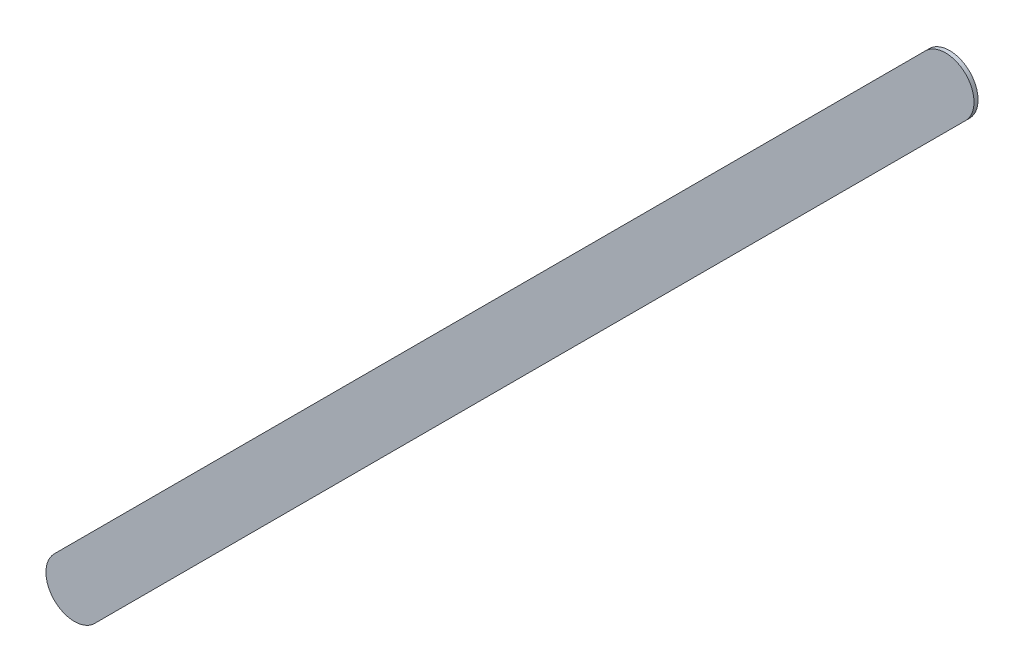
ISO-10303-21;
HEADER;
FILE_DESCRIPTION(('STEP AP214'),'2;1');
FILE_NAME('part.step','',(''),(''),'','','');
FILE_SCHEMA(('AUTOMOTIVE_DESIGN { 1 0 10303 214 1 1 1 1 }'));
ENDSEC;
DATA;
#1=APPLICATION_CONTEXT('core data for automotive mechanical design processes');
#2=APPLICATION_PROTOCOL_DEFINITION('international standard','automotive_design',2000,#1);
#3=PRODUCT_CONTEXT('',#1,'mechanical');
#4=PRODUCT('Part','Part','',(#3));
#5=PRODUCT_RELATED_PRODUCT_CATEGORY('part','',(#4));
#6=PRODUCT_DEFINITION_FORMATION('','',#4);
#7=PRODUCT_DEFINITION_CONTEXT('part definition',#1,'design');
#8=PRODUCT_DEFINITION('design','',#6,#7);
#9=PRODUCT_DEFINITION_SHAPE('','',#8);
#10=(LENGTH_UNIT() NAMED_UNIT(*) SI_UNIT(.MILLI.,.METRE.));
#11=(NAMED_UNIT(*) PLANE_ANGLE_UNIT() SI_UNIT($,.RADIAN.));
#12=(NAMED_UNIT(*) SI_UNIT($,.STERADIAN.) SOLID_ANGLE_UNIT());
#13=UNCERTAINTY_MEASURE_WITH_UNIT(LENGTH_MEASURE(1.E-05),#10,'distance_accuracy_value','');
#14=(GEOMETRIC_REPRESENTATION_CONTEXT(3) GLOBAL_UNCERTAINTY_ASSIGNED_CONTEXT((#13)) GLOBAL_UNIT_ASSIGNED_CONTEXT((#10,
#11,#12)) REPRESENTATION_CONTEXT('',''));
#15=CARTESIAN_POINT('',(0.,0.,0.));
#16=DIRECTION('',(0.,0.,1.));
#17=DIRECTION('',(1.,0.,0.));
#18=AXIS2_PLACEMENT_3D('',#15,#16,#17);
#19=CARTESIAN_POINT('',(89.6779766,72.92442362,0.));
#20=DIRECTION('',(-0.707106781186547,0.707106781186548,0.));
#21=DIRECTION('',(0.707106781186548,0.707106781186547,0.));
#22=AXIS2_PLACEMENT_3D('',#19,#20,#21);
#23=PLANE('',#22);
#24=DIRECTION('',(0.707106781186548,0.707106781186547,0.));
#25=VECTOR('',#24,1.);
#26=CARTESIAN_POINT('',(89.6779766,72.92442362,0.03556));
#27=LINE('',#26,#25);
#28=CARTESIAN_POINT('',(89.6779766,72.92442362,0.03556));
#29=VERTEX_POINT('',#28);
#30=CARTESIAN_POINT('',(97.33077562,80.57722264,0.03556));
#31=VERTEX_POINT('',#30);
#32=EDGE_CURVE('E11',#29,#31,#27,.T.);
#33=ORIENTED_EDGE('',*,*,#32,.F.);
#34=DIRECTION('',(0.,0.,1.));
#35=VECTOR('',#34,1.);
#36=CARTESIAN_POINT('',(89.6779766,72.92442362,0.));
#37=LINE('',#36,#35);
#38=CARTESIAN_POINT('',(89.6779766,72.92442362,0.));
#39=VERTEX_POINT('',#38);
#40=EDGE_CURVE('E24',#39,#29,#37,.T.);
#41=ORIENTED_EDGE('',*,*,#40,.F.);
#42=DIRECTION('',(0.707106781186548,0.707106781186547,0.));
#43=VECTOR('',#42,1.);
#44=CARTESIAN_POINT('',(89.6779766,72.92442362,0.));
#45=LINE('',#44,#43);
#46=CARTESIAN_POINT('',(97.33077562,80.57722264,0.));
#47=VERTEX_POINT('',#46);
#48=EDGE_CURVE('E75',#39,#47,#45,.T.);
#49=ORIENTED_EDGE('',*,*,#48,.T.);
#50=DIRECTION('',(0.,0.,1.));
#51=VECTOR('',#50,1.);
#52=CARTESIAN_POINT('',(97.33077562,80.57722264,0.));
#53=LINE('',#52,#51);
#54=EDGE_CURVE('E37',#47,#31,#53,.T.);
#55=ORIENTED_EDGE('',*,*,#54,.T.);
#56=EDGE_LOOP('',(#33,#41,#49,#55));
#57=FACE_BOUND('',#56,.T.);
#58=ADVANCED_FACE('F17',(#57),#23,.F.);
#59=CARTESIAN_POINT('',(97.15399924,80.75399902,0.));
#60=DIRECTION('',(0.,0.,-1.));
#61=DIRECTION('',(0.707106781186548,-0.707106781186548,0.));
#62=AXIS2_PLACEMENT_3D('',#59,#60,#61);
#63=CYLINDRICAL_SURFACE('',#62,0.249999554103226);
#64=CARTESIAN_POINT('',(97.15399924,80.75399902,0.03556));
#65=DIRECTION('',(0.,0.,1.));
#66=DIRECTION('',(0.707106781186548,-0.707106781186548,0.));
#67=AXIS2_PLACEMENT_3D('',#64,#65,#66);
#68=CIRCLE('',#67,0.249999554103226);
#69=CARTESIAN_POINT('',(96.97722286,80.9307754,0.03556));
#70=VERTEX_POINT('',#69);
#71=EDGE_CURVE('E83',#31,#70,#68,.T.);
#72=ORIENTED_EDGE('',*,*,#71,.F.);
#73=ORIENTED_EDGE('',*,*,#54,.F.);
#74=CARTESIAN_POINT('',(97.15399924,80.75399902,0.));
#75=DIRECTION('',(0.,0.,1.));
#76=DIRECTION('',(0.707106781186548,-0.707106781186548,0.));
#77=AXIS2_PLACEMENT_3D('',#74,#75,#76);
#78=CIRCLE('',#77,0.249999554103226);
#79=CARTESIAN_POINT('',(96.97722286,80.9307754,0.));
#80=VERTEX_POINT('',#79);
#81=EDGE_CURVE('E81',#47,#80,#78,.T.);
#82=ORIENTED_EDGE('',*,*,#81,.T.);
#83=DIRECTION('',(0.,0.,1.));
#84=VECTOR('',#83,1.);
#85=CARTESIAN_POINT('',(96.97722286,80.9307754,0.));
#86=LINE('',#85,#84);
#87=EDGE_CURVE('E67',#80,#70,#86,.T.);
#88=ORIENTED_EDGE('',*,*,#87,.T.);
#89=EDGE_LOOP('',(#72,#73,#82,#88));
#90=FACE_BOUND('',#89,.T.);
#91=ADVANCED_FACE('F89',(#90),#63,.T.);
#92=CARTESIAN_POINT('',(96.97722286,80.9307754,0.));
#93=DIRECTION('',(0.707106781186548,-0.707106781186548,0.));
#94=DIRECTION('',(-0.707106781186548,-0.707106781186548,0.));
#95=AXIS2_PLACEMENT_3D('',#92,#93,#94);
#96=PLANE('',#95);
#97=DIRECTION('',(-0.707106781186548,-0.707106781186548,0.));
#98=VECTOR('',#97,1.);
#99=CARTESIAN_POINT('',(96.97722286,80.9307754,0.03556));
#100=LINE('',#99,#98);
#101=CARTESIAN_POINT('',(89.32442384,73.27797638,0.03556));
#102=VERTEX_POINT('',#101);
#103=EDGE_CURVE('E71',#70,#102,#100,.T.);
#104=ORIENTED_EDGE('',*,*,#103,.F.);
#105=ORIENTED_EDGE('',*,*,#87,.F.);
#106=DIRECTION('',(-0.707106781186548,-0.707106781186548,0.));
#107=VECTOR('',#106,1.);
#108=CARTESIAN_POINT('',(96.97722286,80.9307754,0.));
#109=LINE('',#108,#107);
#110=CARTESIAN_POINT('',(89.32442384,73.27797638,0.));
#111=VERTEX_POINT('',#110);
#112=EDGE_CURVE('E63',#80,#111,#109,.T.);
#113=ORIENTED_EDGE('',*,*,#112,.T.);
#114=DIRECTION('',(0.,0.,1.));
#115=VECTOR('',#114,1.);
#116=CARTESIAN_POINT('',(89.32442384,73.27797638,0.));
#117=LINE('',#116,#115);
#118=EDGE_CURVE('E53',#111,#102,#117,.T.);
#119=ORIENTED_EDGE('',*,*,#118,.T.);
#120=EDGE_LOOP('',(#104,#105,#113,#119));
#121=FACE_BOUND('',#120,.T.);
#122=ADVANCED_FACE('F66',(#121),#96,.F.);
#123=CARTESIAN_POINT('',(89.50120022,73.1012,0.));
#124=DIRECTION('',(0.,0.,-1.));
#125=DIRECTION('',(-0.707106781186548,0.707106781186548,0.));
#126=AXIS2_PLACEMENT_3D('',#123,#124,#125);
#127=CYLINDRICAL_SURFACE('',#126,0.24999955410322);
#128=CARTESIAN_POINT('',(89.50120022,73.1012,0.03556));
#129=DIRECTION('',(0.,0.,1.));
#130=DIRECTION('',(-0.707106781186548,0.707106781186548,0.));
#131=AXIS2_PLACEMENT_3D('',#128,#129,#130);
#132=CIRCLE('',#131,0.24999955410322);
#133=EDGE_CURVE('E59',#102,#29,#132,.T.);
#134=ORIENTED_EDGE('',*,*,#133,.F.);
#135=ORIENTED_EDGE('',*,*,#118,.F.);
#136=CARTESIAN_POINT('',(89.50120022,73.1012,0.));
#137=DIRECTION('',(0.,0.,1.));
#138=DIRECTION('',(-0.707106781186548,0.707106781186548,0.));
#139=AXIS2_PLACEMENT_3D('',#136,#137,#138);
#140=CIRCLE('',#139,0.24999955410322);
#141=EDGE_CURVE('E57',#111,#39,#140,.T.);
#142=ORIENTED_EDGE('',*,*,#141,.T.);
#143=ORIENTED_EDGE('',*,*,#40,.T.);
#144=EDGE_LOOP('',(#134,#135,#142,#143));
#145=FACE_BOUND('',#144,.T.);
#146=ADVANCED_FACE('F55',(#145),#127,.T.);
#147=CARTESIAN_POINT('',(89.6779766,72.92442362,0.));
#148=DIRECTION('',(0.,0.,-1.));
#149=DIRECTION('',(-1.,0.,0.));
#150=AXIS2_PLACEMENT_3D('',#147,#148,#149);
#151=PLANE('',#150);
#152=ORIENTED_EDGE('',*,*,#141,.F.);
#153=ORIENTED_EDGE('',*,*,#112,.F.);
#154=ORIENTED_EDGE('',*,*,#81,.F.);
#155=ORIENTED_EDGE('',*,*,#48,.F.);
#156=EDGE_LOOP('',(#152,#153,#154,#155));
#157=FACE_BOUND('',#156,.T.);
#158=ADVANCED_FACE('F74',(#157),#151,.T.);
#159=CARTESIAN_POINT('',(89.6779766,72.92442362,0.03556));
#160=DIRECTION('',(0.,0.,-1.));
#161=DIRECTION('',(-1.,0.,0.));
#162=AXIS2_PLACEMENT_3D('',#159,#160,#161);
#163=PLANE('',#162);
#164=ORIENTED_EDGE('',*,*,#32,.T.);
#165=ORIENTED_EDGE('',*,*,#71,.T.);
#166=ORIENTED_EDGE('',*,*,#103,.T.);
#167=ORIENTED_EDGE('',*,*,#133,.T.);
#168=EDGE_LOOP('',(#164,#165,#166,#167));
#169=FACE_BOUND('',#168,.T.);
#170=ADVANCED_FACE('F91',(#169),#163,.F.);
#171=CLOSED_SHELL('',(#58,#91,#122,#146,#158,#170));
#172=MANIFOLD_SOLID_BREP('B1',#171);
#173=ADVANCED_BREP_SHAPE_REPRESENTATION('',(#18,#172),#14);
#174=SHAPE_DEFINITION_REPRESENTATION(#9,#173);
ENDSEC;
END-ISO-10303-21;
